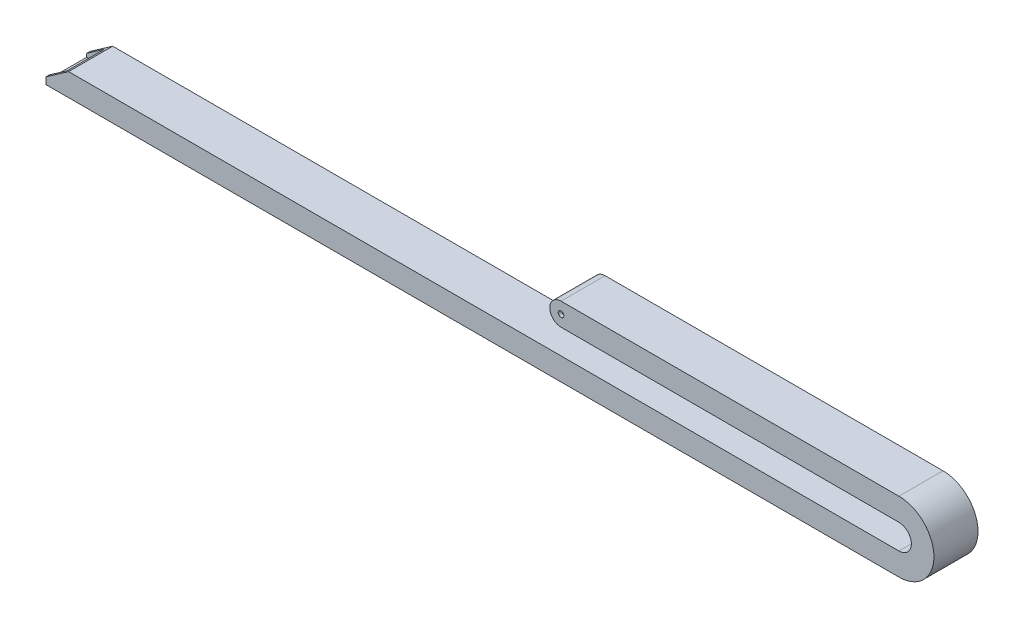
ISO-10303-21;
HEADER;
FILE_DESCRIPTION(('STEP AP214'),'2;1');
FILE_NAME('part.step','',(''),(''),'','','');
FILE_SCHEMA(('AUTOMOTIVE_DESIGN { 1 0 10303 214 1 1 1 1 }'));
ENDSEC;
DATA;
#1=APPLICATION_CONTEXT('core data for automotive mechanical design processes');
#2=APPLICATION_PROTOCOL_DEFINITION('international standard','automotive_design',2000,#1);
#3=PRODUCT_CONTEXT('',#1,'mechanical');
#4=PRODUCT('Part','Part','',(#3));
#5=PRODUCT_RELATED_PRODUCT_CATEGORY('part','',(#4));
#6=PRODUCT_DEFINITION_FORMATION('','',#4);
#7=PRODUCT_DEFINITION_CONTEXT('part definition',#1,'design');
#8=PRODUCT_DEFINITION('design','',#6,#7);
#9=PRODUCT_DEFINITION_SHAPE('','',#8);
#10=(LENGTH_UNIT() NAMED_UNIT(*) SI_UNIT(.MILLI.,.METRE.));
#11=(NAMED_UNIT(*) PLANE_ANGLE_UNIT() SI_UNIT($,.RADIAN.));
#12=(NAMED_UNIT(*) SI_UNIT($,.STERADIAN.) SOLID_ANGLE_UNIT());
#13=UNCERTAINTY_MEASURE_WITH_UNIT(LENGTH_MEASURE(1.E-05),#10,'distance_accuracy_value','');
#14=(GEOMETRIC_REPRESENTATION_CONTEXT(3) GLOBAL_UNCERTAINTY_ASSIGNED_CONTEXT((#13)) GLOBAL_UNIT_ASSIGNED_CONTEXT((#10,
#11,#12)) REPRESENTATION_CONTEXT('',''));
#15=CARTESIAN_POINT('',(0.,0.,0.));
#16=DIRECTION('',(0.,0.,1.));
#17=DIRECTION('',(1.,0.,0.));
#18=AXIS2_PLACEMENT_3D('',#15,#16,#17);
#19=CARTESIAN_POINT('',(-425.902299808804,39.9999999999996,39.));
#20=DIRECTION('',(0.57357643635105,-0.819152044288989,0.));
#21=DIRECTION('',(0.819152044288989,0.57357643635105,0.));
#22=AXIS2_PLACEMENT_3D('',#19,#20,#21);
#23=PLANE('',#22);
#24=DIRECTION('',(0.,0.,-1.));
#25=VECTOR('',#24,1.);
#26=CARTESIAN_POINT('',(-445.896371903194,25.9999999999996,39.));
#27=LINE('',#26,#25);
#28=CARTESIAN_POINT('',(-445.896371903194,25.9999999999996,3.));
#29=VERTEX_POINT('',#28);
#30=CARTESIAN_POINT('',(-445.896371903194,25.9999999999996,0.));
#31=VERTEX_POINT('',#30);
#32=EDGE_CURVE('E41',#29,#31,#27,.T.);
#33=ORIENTED_EDGE('',*,*,#32,.F.);
#34=DIRECTION('',(-0.819152044288989,-0.57357643635105,0.));
#35=VECTOR('',#34,1.);
#36=CARTESIAN_POINT('',(-425.902299808804,39.9999999999996,3.));
#37=LINE('',#36,#35);
#38=CARTESIAN_POINT('',(-430.18674382903,36.9999999999996,3.));
#39=VERTEX_POINT('',#38);
#40=EDGE_CURVE('E172',#39,#29,#37,.T.);
#41=ORIENTED_EDGE('',*,*,#40,.F.);
#42=DIRECTION('',(0.,0.,-1.));
#43=VECTOR('',#42,1.);
#44=CARTESIAN_POINT('',(-430.18674382903,36.9999999999996,39.));
#45=LINE('',#44,#43);
#46=CARTESIAN_POINT('',(-430.18674382903,36.9999999999996,36.));
#47=VERTEX_POINT('',#46);
#48=EDGE_CURVE('E228',#47,#39,#45,.T.);
#49=ORIENTED_EDGE('',*,*,#48,.F.);
#50=DIRECTION('',(-0.819152044288989,-0.57357643635105,0.));
#51=VECTOR('',#50,1.);
#52=CARTESIAN_POINT('',(-425.902299808804,39.9999999999996,36.));
#53=LINE('',#52,#51);
#54=CARTESIAN_POINT('',(-445.896371903194,25.9999999999996,36.));
#55=VERTEX_POINT('',#54);
#56=EDGE_CURVE('E207',#47,#55,#53,.T.);
#57=ORIENTED_EDGE('',*,*,#56,.T.);
#58=CARTESIAN_POINT('',(-445.896371903194,25.9999999999996,39.));
#59=VERTEX_POINT('',#58);
#60=EDGE_CURVE('E11',#59,#55,#27,.T.);
#61=ORIENTED_EDGE('',*,*,#60,.F.);
#62=DIRECTION('',(-0.819152044288989,-0.57357643635105,0.));
#63=VECTOR('',#62,1.);
#64=CARTESIAN_POINT('',(-425.902299808804,39.9999999999996,39.));
#65=LINE('',#64,#63);
#66=CARTESIAN_POINT('',(-425.902299808804,39.9999999999996,39.));
#67=VERTEX_POINT('',#66);
#68=EDGE_CURVE('E235',#67,#59,#65,.T.);
#69=ORIENTED_EDGE('',*,*,#68,.F.);
#70=DIRECTION('',(0.,0.,-1.));
#71=VECTOR('',#70,1.);
#72=CARTESIAN_POINT('',(-425.902299808804,39.9999999999996,39.));
#73=LINE('',#72,#71);
#74=CARTESIAN_POINT('',(-425.902299808804,39.9999999999996,0.));
#75=VERTEX_POINT('',#74);
#76=EDGE_CURVE('E255',#67,#75,#73,.T.);
#77=ORIENTED_EDGE('',*,*,#76,.T.);
#78=DIRECTION('',(-0.819152044288989,-0.57357643635105,0.));
#79=VECTOR('',#78,1.);
#80=CARTESIAN_POINT('',(-425.902299808804,39.9999999999996,0.));
#81=LINE('',#80,#79);
#82=EDGE_CURVE('E202',#75,#31,#81,.T.);
#83=ORIENTED_EDGE('',*,*,#82,.T.);
#84=EDGE_LOOP('',(#33,#41,#49,#57,#61,#69,#77,#83));
#85=FACE_BOUND('',#84,.T.);
#86=ADVANCED_FACE('F33',(#85),#23,.F.);
#87=CARTESIAN_POINT('',(-445.896371903194,25.9999999999996,39.));
#88=DIRECTION('',(1.,0.,0.));
#89=DIRECTION('',(0.,1.,0.));
#90=AXIS2_PLACEMENT_3D('',#87,#88,#89);
#91=PLANE('',#90);
#92=DIRECTION('',(0.,0.,1.));
#93=VECTOR('',#92,1.);
#94=CARTESIAN_POINT('',(-445.896371903194,22.9999999999996,3.));
#95=LINE('',#94,#93);
#96=CARTESIAN_POINT('',(-445.896371903194,22.9999999999996,3.));
#97=VERTEX_POINT('',#96);
#98=CARTESIAN_POINT('',(-445.896371903194,22.9999999999996,36.));
#99=VERTEX_POINT('',#98);
#100=EDGE_CURVE('E165',#97,#99,#95,.T.);
#101=ORIENTED_EDGE('',*,*,#100,.F.);
#102=DIRECTION('',(0.,-1.,0.));
#103=VECTOR('',#102,1.);
#104=CARTESIAN_POINT('',(-445.896371903194,36.9999999999996,3.));
#105=LINE('',#104,#103);
#106=EDGE_CURVE('E175',#29,#97,#105,.T.);
#107=ORIENTED_EDGE('',*,*,#106,.F.);
#108=ORIENTED_EDGE('',*,*,#32,.T.);
#109=DIRECTION('',(0.,-1.,0.));
#110=VECTOR('',#109,1.);
#111=CARTESIAN_POINT('',(-445.896371903194,25.9999999999996,0.));
#112=LINE('',#111,#110);
#113=CARTESIAN_POINT('',(-445.896371903194,19.9999999999996,0.));
#114=VERTEX_POINT('',#113);
#115=EDGE_CURVE('E258',#31,#114,#112,.T.);
#116=ORIENTED_EDGE('',*,*,#115,.T.);
#117=DIRECTION('',(0.,0.,-1.));
#118=VECTOR('',#117,1.);
#119=CARTESIAN_POINT('',(-445.896371903194,19.9999999999996,39.));
#120=LINE('',#119,#118);
#121=CARTESIAN_POINT('',(-445.896371903194,19.9999999999996,39.));
#122=VERTEX_POINT('',#121);
#123=EDGE_CURVE('E293',#122,#114,#120,.T.);
#124=ORIENTED_EDGE('',*,*,#123,.F.);
#125=DIRECTION('',(0.,-1.,0.));
#126=VECTOR('',#125,1.);
#127=CARTESIAN_POINT('',(-445.896371903194,25.9999999999996,39.));
#128=LINE('',#127,#126);
#129=EDGE_CURVE('E238',#59,#122,#128,.T.);
#130=ORIENTED_EDGE('',*,*,#129,.F.);
#131=ORIENTED_EDGE('',*,*,#60,.T.);
#132=DIRECTION('',(0.,1.,0.));
#133=VECTOR('',#132,1.);
#134=CARTESIAN_POINT('',(-445.896371903194,36.9999999999996,36.));
#135=LINE('',#134,#133);
#136=EDGE_CURVE('E184',#99,#55,#135,.T.);
#137=ORIENTED_EDGE('',*,*,#136,.F.);
#138=EDGE_LOOP('',(#101,#107,#108,#116,#124,#130,#131,#137));
#139=FACE_BOUND('',#138,.T.);
#140=ADVANCED_FACE('F182',(#139),#91,.F.);
#141=CARTESIAN_POINT('',(-445.896371903194,19.9999999999996,39.));
#142=DIRECTION('',(0.,1.,0.));
#143=DIRECTION('',(-1.,0.,0.));
#144=AXIS2_PLACEMENT_3D('',#141,#142,#143);
#145=PLANE('',#144);
#146=DIRECTION('',(1.,0.,0.));
#147=VECTOR('',#146,1.);
#148=CARTESIAN_POINT('',(-445.896371903194,19.9999999999996,0.));
#149=LINE('',#148,#147);
#150=CARTESIAN_POINT('',(309.062127232909,20.0000000000002,0.));
#151=VERTEX_POINT('',#150);
#152=EDGE_CURVE('E260',#114,#151,#149,.T.);
#153=ORIENTED_EDGE('',*,*,#152,.T.);
#154=DIRECTION('',(0.,0.,-1.));
#155=VECTOR('',#154,1.);
#156=CARTESIAN_POINT('',(309.062127232909,20.0000000000002,39.));
#157=LINE('',#156,#155);
#158=CARTESIAN_POINT('',(309.062127232909,20.0000000000002,39.));
#159=VERTEX_POINT('',#158);
#160=EDGE_CURVE('E290',#159,#151,#157,.T.);
#161=ORIENTED_EDGE('',*,*,#160,.F.);
#162=DIRECTION('',(1.,0.,0.));
#163=VECTOR('',#162,1.);
#164=CARTESIAN_POINT('',(-445.896371903194,19.9999999999996,39.));
#165=LINE('',#164,#163);
#166=EDGE_CURVE('E241',#122,#159,#165,.T.);
#167=ORIENTED_EDGE('',*,*,#166,.F.);
#168=ORIENTED_EDGE('',*,*,#123,.T.);
#169=EDGE_LOOP('',(#153,#161,#167,#168));
#170=FACE_BOUND('',#169,.T.);
#171=ADVANCED_FACE('F337',(#170),#145,.F.);
#172=CARTESIAN_POINT('',(309.062127232909,51.0000000000001,39.));
#173=DIRECTION('',(0.,0.,-1.));
#174=DIRECTION('',(-1.,0.,0.));
#175=AXIS2_PLACEMENT_3D('',#172,#173,#174);
#176=CYLINDRICAL_SURFACE('',#175,30.9999999999999);
#177=CARTESIAN_POINT('',(309.062127232909,51.0000000000001,0.));
#178=DIRECTION('',(0.,0.,1.));
#179=DIRECTION('',(1.,0.,0.));
#180=AXIS2_PLACEMENT_3D('',#177,#178,#179);
#181=CIRCLE('',#180,30.9999999999999);
#182=CARTESIAN_POINT('',(309.062127232909,82.0000000000001,0.));
#183=VERTEX_POINT('',#182);
#184=EDGE_CURVE('E262',#151,#183,#181,.T.);
#185=ORIENTED_EDGE('',*,*,#184,.T.);
#186=DIRECTION('',(0.,0.,-1.));
#187=VECTOR('',#186,1.);
#188=CARTESIAN_POINT('',(309.062127232909,82.0000000000001,39.));
#189=LINE('',#188,#187);
#190=CARTESIAN_POINT('',(309.062127232909,82.0000000000001,39.));
#191=VERTEX_POINT('',#190);
#192=EDGE_CURVE('E287',#191,#183,#189,.T.);
#193=ORIENTED_EDGE('',*,*,#192,.F.);
#194=CARTESIAN_POINT('',(309.062127232909,51.0000000000001,39.));
#195=DIRECTION('',(0.,0.,1.));
#196=DIRECTION('',(1.,0.,0.));
#197=AXIS2_PLACEMENT_3D('',#194,#195,#196);
#198=CIRCLE('',#197,30.9999999999999);
#199=EDGE_CURVE('E243',#159,#191,#198,.T.);
#200=ORIENTED_EDGE('',*,*,#199,.F.);
#201=ORIENTED_EDGE('',*,*,#160,.T.);
#202=EDGE_LOOP('',(#185,#193,#200,#201));
#203=FACE_BOUND('',#202,.T.);
#204=ADVANCED_FACE('F335',(#203),#176,.T.);
#205=CARTESIAN_POINT('',(309.062127232909,82.0000000000001,39.));
#206=DIRECTION('',(0.,-1.,0.));
#207=DIRECTION('',(1.,0.,0.));
#208=AXIS2_PLACEMENT_3D('',#205,#206,#207);
#209=PLANE('',#208);
#210=DIRECTION('',(-1.,0.,0.));
#211=VECTOR('',#210,1.);
#212=CARTESIAN_POINT('',(309.062127232909,82.0000000000001,0.));
#213=LINE('',#212,#211);
#214=CARTESIAN_POINT('',(10.0000000000079,82.0000000000001,0.));
#215=VERTEX_POINT('',#214);
#216=EDGE_CURVE('E264',#183,#215,#213,.T.);
#217=ORIENTED_EDGE('',*,*,#216,.T.);
#218=DIRECTION('',(0.,0.,-1.));
#219=VECTOR('',#218,1.);
#220=CARTESIAN_POINT('',(10.0000000000079,82.0000000000001,39.));
#221=LINE('',#220,#219);
#222=CARTESIAN_POINT('',(10.0000000000079,82.0000000000001,39.));
#223=VERTEX_POINT('',#222);
#224=EDGE_CURVE('E284',#223,#215,#221,.T.);
#225=ORIENTED_EDGE('',*,*,#224,.F.);
#226=DIRECTION('',(-1.,0.,0.));
#227=VECTOR('',#226,1.);
#228=CARTESIAN_POINT('',(309.062127232909,82.0000000000001,39.));
#229=LINE('',#228,#227);
#230=EDGE_CURVE('E245',#191,#223,#229,.T.);
#231=ORIENTED_EDGE('',*,*,#230,.F.);
#232=ORIENTED_EDGE('',*,*,#192,.T.);
#233=EDGE_LOOP('',(#217,#225,#231,#232));
#234=FACE_BOUND('',#233,.T.);
#235=ADVANCED_FACE('F330',(#234),#209,.F.);
#236=CARTESIAN_POINT('',(10.0000000000079,72.0000000000001,39.));
#237=DIRECTION('',(0.,0.,-1.));
#238=DIRECTION('',(-1.,0.,0.));
#239=AXIS2_PLACEMENT_3D('',#236,#237,#238);
#240=CYLINDRICAL_SURFACE('',#239,10.);
#241=DIRECTION('',(0.,0.,-1.));
#242=VECTOR('',#241,1.);
#243=CARTESIAN_POINT('',(2.85857157146506,65.0000000000001,39.));
#244=LINE('',#243,#242);
#245=CARTESIAN_POINT('',(2.85857157146506,65.0000000000001,36.));
#246=VERTEX_POINT('',#245);
#247=CARTESIAN_POINT('',(2.85857157146506,65.0000000000001,3.));
#248=VERTEX_POINT('',#247);
#249=EDGE_CURVE('E186',#246,#248,#244,.T.);
#250=ORIENTED_EDGE('',*,*,#249,.T.);
#251=CARTESIAN_POINT('',(10.0000000000079,72.0000000000001,3.));
#252=DIRECTION('',(0.,0.,-1.));
#253=DIRECTION('',(0.,1.,0.));
#254=AXIS2_PLACEMENT_3D('',#251,#252,#253);
#255=CIRCLE('',#254,10.);
#256=CARTESIAN_POINT('',(2.85857157146506,79.0000000000001,3.));
#257=VERTEX_POINT('',#256);
#258=EDGE_CURVE('E198',#248,#257,#255,.T.);
#259=ORIENTED_EDGE('',*,*,#258,.T.);
#260=DIRECTION('',(0.,0.,-1.));
#261=VECTOR('',#260,1.);
#262=CARTESIAN_POINT('',(2.85857157146506,79.0000000000001,39.));
#263=LINE('',#262,#261);
#264=CARTESIAN_POINT('',(2.85857157146506,79.0000000000001,36.));
#265=VERTEX_POINT('',#264);
#266=EDGE_CURVE('E192',#257,#265,#263,.F.);
#267=ORIENTED_EDGE('',*,*,#266,.T.);
#268=CARTESIAN_POINT('',(10.0000000000079,72.0000000000001,36.));
#269=DIRECTION('',(0.,0.,1.));
#270=DIRECTION('',(1.,0.,0.));
#271=AXIS2_PLACEMENT_3D('',#268,#269,#270);
#272=CIRCLE('',#271,10.);
#273=EDGE_CURVE('E195',#265,#246,#272,.T.);
#274=ORIENTED_EDGE('',*,*,#273,.T.);
#275=EDGE_LOOP('',(#250,#259,#267,#274));
#276=FACE_BOUND('',#275,.T.);
#277=CARTESIAN_POINT('',(10.0000000000079,72.0000000000001,0.));
#278=DIRECTION('',(0.,0.,1.));
#279=DIRECTION('',(1.,0.,0.));
#280=AXIS2_PLACEMENT_3D('',#277,#278,#279);
#281=CIRCLE('',#280,10.);
#282=CARTESIAN_POINT('',(10.0000000000079,62.0000000000001,0.));
#283=VERTEX_POINT('',#282);
#284=EDGE_CURVE('E266',#215,#283,#281,.T.);
#285=ORIENTED_EDGE('',*,*,#284,.T.);
#286=DIRECTION('',(0.,0.,-1.));
#287=VECTOR('',#286,1.);
#288=CARTESIAN_POINT('',(10.0000000000079,62.0000000000001,39.));
#289=LINE('',#288,#287);
#290=CARTESIAN_POINT('',(10.0000000000079,62.0000000000001,39.));
#291=VERTEX_POINT('',#290);
#292=EDGE_CURVE('E281',#291,#283,#289,.T.);
#293=ORIENTED_EDGE('',*,*,#292,.F.);
#294=CARTESIAN_POINT('',(10.0000000000079,72.0000000000001,39.));
#295=DIRECTION('',(0.,0.,1.));
#296=DIRECTION('',(1.,0.,0.));
#297=AXIS2_PLACEMENT_3D('',#294,#295,#296);
#298=CIRCLE('',#297,10.);
#299=EDGE_CURVE('E247',#223,#291,#298,.T.);
#300=ORIENTED_EDGE('',*,*,#299,.F.);
#301=ORIENTED_EDGE('',*,*,#224,.T.);
#302=EDGE_LOOP('',(#285,#293,#300,#301));
#303=FACE_BOUND('',#302,.T.);
#304=ADVANCED_FACE('F326',(#276,#303),#240,.T.);
#305=CARTESIAN_POINT('',(10.0000000000079,62.0000000000001,39.));
#306=DIRECTION('',(0.,1.,0.));
#307=DIRECTION('',(-1.,0.,0.));
#308=AXIS2_PLACEMENT_3D('',#305,#306,#307);
#309=PLANE('',#308);
#310=DIRECTION('',(1.,0.,0.));
#311=VECTOR('',#310,1.);
#312=CARTESIAN_POINT('',(10.0000000000079,62.0000000000001,0.));
#313=LINE('',#312,#311);
#314=CARTESIAN_POINT('',(309.062127232909,62.0000000000001,0.));
#315=VERTEX_POINT('',#314);
#316=EDGE_CURVE('E268',#283,#315,#313,.T.);
#317=ORIENTED_EDGE('',*,*,#316,.T.);
#318=DIRECTION('',(0.,0.,-1.));
#319=VECTOR('',#318,1.);
#320=CARTESIAN_POINT('',(309.062127232909,62.0000000000001,39.));
#321=LINE('',#320,#319);
#322=CARTESIAN_POINT('',(309.062127232909,62.0000000000001,39.));
#323=VERTEX_POINT('',#322);
#324=EDGE_CURVE('E278',#323,#315,#321,.T.);
#325=ORIENTED_EDGE('',*,*,#324,.F.);
#326=DIRECTION('',(1.,0.,0.));
#327=VECTOR('',#326,1.);
#328=CARTESIAN_POINT('',(10.0000000000079,62.0000000000001,39.));
#329=LINE('',#328,#327);
#330=EDGE_CURVE('E249',#291,#323,#329,.T.);
#331=ORIENTED_EDGE('',*,*,#330,.F.);
#332=ORIENTED_EDGE('',*,*,#292,.T.);
#333=EDGE_LOOP('',(#317,#325,#331,#332));
#334=FACE_BOUND('',#333,.T.);
#335=ADVANCED_FACE('F322',(#334),#309,.F.);
#336=CARTESIAN_POINT('',(309.062127232909,51.0000000000001,39.));
#337=DIRECTION('',(0.,0.,-1.));
#338=DIRECTION('',(-1.,0.,0.));
#339=AXIS2_PLACEMENT_3D('',#336,#337,#338);
#340=CYLINDRICAL_SURFACE('',#339,10.9999999999999);
#341=CARTESIAN_POINT('',(309.062127232909,51.0000000000001,0.));
#342=DIRECTION('',(0.,0.,-1.));
#343=DIRECTION('',(1.,0.,0.));
#344=AXIS2_PLACEMENT_3D('',#341,#342,#343);
#345=CIRCLE('',#344,10.9999999999999);
#346=CARTESIAN_POINT('',(309.062127232909,40.0000000000002,0.));
#347=VERTEX_POINT('',#346);
#348=EDGE_CURVE('E270',#315,#347,#345,.T.);
#349=ORIENTED_EDGE('',*,*,#348,.T.);
#350=DIRECTION('',(0.,0.,-1.));
#351=VECTOR('',#350,1.);
#352=CARTESIAN_POINT('',(309.062127232909,40.0000000000002,39.));
#353=LINE('',#352,#351);
#354=CARTESIAN_POINT('',(309.062127232909,40.0000000000002,39.));
#355=VERTEX_POINT('',#354);
#356=EDGE_CURVE('E275',#355,#347,#353,.T.);
#357=ORIENTED_EDGE('',*,*,#356,.F.);
#358=CARTESIAN_POINT('',(309.062127232909,51.0000000000001,39.));
#359=DIRECTION('',(0.,0.,-1.));
#360=DIRECTION('',(1.,0.,0.));
#361=AXIS2_PLACEMENT_3D('',#358,#359,#360);
#362=CIRCLE('',#361,10.9999999999999);
#363=EDGE_CURVE('E251',#323,#355,#362,.T.);
#364=ORIENTED_EDGE('',*,*,#363,.F.);
#365=ORIENTED_EDGE('',*,*,#324,.T.);
#366=EDGE_LOOP('',(#349,#357,#364,#365));
#367=FACE_BOUND('',#366,.T.);
#368=ADVANCED_FACE('F317',(#367),#340,.F.);
#369=CARTESIAN_POINT('',(309.062127232909,40.0000000000002,39.));
#370=DIRECTION('',(0.,-1.,0.));
#371=DIRECTION('',(1.,0.,0.));
#372=AXIS2_PLACEMENT_3D('',#369,#370,#371);
#373=PLANE('',#372);
#374=DIRECTION('',(-1.,0.,0.));
#375=VECTOR('',#374,1.);
#376=CARTESIAN_POINT('',(309.062127232909,40.0000000000002,0.));
#377=LINE('',#376,#375);
#378=EDGE_CURVE('E239',#347,#75,#377,.T.);
#379=ORIENTED_EDGE('',*,*,#378,.T.);
#380=ORIENTED_EDGE('',*,*,#76,.F.);
#381=DIRECTION('',(-1.,0.,0.));
#382=VECTOR('',#381,1.);
#383=CARTESIAN_POINT('',(309.062127232909,40.0000000000002,39.));
#384=LINE('',#383,#382);
#385=EDGE_CURVE('E253',#355,#67,#384,.T.);
#386=ORIENTED_EDGE('',*,*,#385,.F.);
#387=ORIENTED_EDGE('',*,*,#356,.T.);
#388=EDGE_LOOP('',(#379,#380,#386,#387));
#389=FACE_BOUND('',#388,.T.);
#390=ADVANCED_FACE('F311',(#389),#373,.F.);
#391=CARTESIAN_POINT('',(309.062127232909,51.0000000000001,39.));
#392=DIRECTION('',(0.,0.,1.));
#393=DIRECTION('',(1.,0.,0.));
#394=AXIS2_PLACEMENT_3D('',#391,#392,#393);
#395=PLANE('',#394);
#396=CARTESIAN_POINT('',(10.0000000000079,72.0000000000001,39.));
#397=DIRECTION('',(0.,0.,1.));
#398=DIRECTION('',(1.,0.,0.));
#399=AXIS2_PLACEMENT_3D('',#396,#397,#398);
#400=CIRCLE('',#399,2.5);
#401=CARTESIAN_POINT('',(12.5000000000079,72.0000000000001,39.));
#402=VERTEX_POINT('',#401);
#403=EDGE_CURVE('E412',#402,#402,#400,.T.);
#404=ORIENTED_EDGE('',*,*,#403,.F.);
#405=EDGE_LOOP('',(#404));
#406=FACE_BOUND('',#405,.T.);
#407=ORIENTED_EDGE('',*,*,#68,.T.);
#408=ORIENTED_EDGE('',*,*,#129,.T.);
#409=ORIENTED_EDGE('',*,*,#166,.T.);
#410=ORIENTED_EDGE('',*,*,#199,.T.);
#411=ORIENTED_EDGE('',*,*,#230,.T.);
#412=ORIENTED_EDGE('',*,*,#299,.T.);
#413=ORIENTED_EDGE('',*,*,#330,.T.);
#414=ORIENTED_EDGE('',*,*,#363,.T.);
#415=ORIENTED_EDGE('',*,*,#385,.T.);
#416=EDGE_LOOP('',(#407,#408,#409,#410,#411,#412,#413,#414,#415));
#417=FACE_BOUND('',#416,.T.);
#418=ADVANCED_FACE('F339',(#406,#417),#395,.T.);
#419=CARTESIAN_POINT('',(309.062127232909,51.0000000000001,0.));
#420=DIRECTION('',(0.,0.,1.));
#421=DIRECTION('',(1.,0.,0.));
#422=AXIS2_PLACEMENT_3D('',#419,#420,#421);
#423=PLANE('',#422);
#424=CARTESIAN_POINT('',(10.0000000000079,72.0000000000001,0.));
#425=DIRECTION('',(0.,0.,1.));
#426=DIRECTION('',(1.,0.,0.));
#427=AXIS2_PLACEMENT_3D('',#424,#425,#426);
#428=CIRCLE('',#427,2.5);
#429=CARTESIAN_POINT('',(12.5000000000079,72.0000000000001,0.));
#430=VERTEX_POINT('',#429);
#431=EDGE_CURVE('E409',#430,#430,#428,.T.);
#432=ORIENTED_EDGE('',*,*,#431,.T.);
#433=EDGE_LOOP('',(#432));
#434=FACE_BOUND('',#433,.T.);
#435=ORIENTED_EDGE('',*,*,#82,.F.);
#436=ORIENTED_EDGE('',*,*,#378,.F.);
#437=ORIENTED_EDGE('',*,*,#348,.F.);
#438=ORIENTED_EDGE('',*,*,#316,.F.);
#439=ORIENTED_EDGE('',*,*,#284,.F.);
#440=ORIENTED_EDGE('',*,*,#216,.F.);
#441=ORIENTED_EDGE('',*,*,#184,.F.);
#442=ORIENTED_EDGE('',*,*,#152,.F.);
#443=ORIENTED_EDGE('',*,*,#115,.F.);
#444=EDGE_LOOP('',(#435,#436,#437,#438,#439,#440,#441,#442,#443));
#445=FACE_BOUND('',#444,.T.);
#446=ADVANCED_FACE('F303',(#434,#445),#423,.F.);
#447=CARTESIAN_POINT('',(-445.896371903194,22.9999999999996,39.));
#448=DIRECTION('',(0.,1.,0.));
#449=DIRECTION('',(-1.,0.,0.));
#450=AXIS2_PLACEMENT_3D('',#447,#448,#449);
#451=PLANE('',#450);
#452=DIRECTION('',(1.,0.,0.));
#453=VECTOR('',#452,1.);
#454=CARTESIAN_POINT('',(-445.896371903194,22.9999999999996,36.));
#455=LINE('',#454,#453);
#456=CARTESIAN_POINT('',(309.062127232909,23.0000000000002,36.));
#457=VERTEX_POINT('',#456);
#458=EDGE_CURVE('E204',#99,#457,#455,.T.);
#459=ORIENTED_EDGE('',*,*,#458,.T.);
#460=DIRECTION('',(0.,0.,-1.));
#461=VECTOR('',#460,1.);
#462=CARTESIAN_POINT('',(309.062127232909,23.0000000000002,39.));
#463=LINE('',#462,#461);
#464=CARTESIAN_POINT('',(309.062127232909,23.0000000000002,3.));
#465=VERTEX_POINT('',#464);
#466=EDGE_CURVE('E168',#457,#465,#463,.T.);
#467=ORIENTED_EDGE('',*,*,#466,.T.);
#468=DIRECTION('',(1.,0.,0.));
#469=VECTOR('',#468,1.);
#470=CARTESIAN_POINT('',(-445.896371903194,22.9999999999996,3.));
#471=LINE('',#470,#469);
#472=EDGE_CURVE('E161',#97,#465,#471,.T.);
#473=ORIENTED_EDGE('',*,*,#472,.F.);
#474=ORIENTED_EDGE('',*,*,#100,.T.);
#475=EDGE_LOOP('',(#459,#467,#473,#474));
#476=FACE_BOUND('',#475,.T.);
#477=ADVANCED_FACE('F163',(#476),#451,.T.);
#478=CARTESIAN_POINT('',(309.062127232909,51.0000000000001,39.));
#479=DIRECTION('',(0.,0.,-1.));
#480=DIRECTION('',(-1.,0.,0.));
#481=AXIS2_PLACEMENT_3D('',#478,#479,#480);
#482=CYLINDRICAL_SURFACE('',#481,27.9999999999999);
#483=CARTESIAN_POINT('',(309.062127232909,51.0000000000001,3.));
#484=DIRECTION('',(0.,0.,1.));
#485=DIRECTION('',(1.,0.,0.));
#486=AXIS2_PLACEMENT_3D('',#483,#484,#485);
#487=CIRCLE('',#486,27.9999999999999);
#488=CARTESIAN_POINT('',(309.062127232909,79.0000000000001,3.));
#489=VERTEX_POINT('',#488);
#490=EDGE_CURVE('E171',#465,#489,#487,.T.);
#491=ORIENTED_EDGE('',*,*,#490,.F.);
#492=ORIENTED_EDGE('',*,*,#466,.F.);
#493=CARTESIAN_POINT('',(309.062127232909,51.0000000000001,36.));
#494=DIRECTION('',(0.,0.,1.));
#495=DIRECTION('',(1.,0.,0.));
#496=AXIS2_PLACEMENT_3D('',#493,#494,#495);
#497=CIRCLE('',#496,27.9999999999999);
#498=CARTESIAN_POINT('',(309.062127232909,79.0000000000001,36.));
#499=VERTEX_POINT('',#498);
#500=EDGE_CURVE('E206',#457,#499,#497,.T.);
#501=ORIENTED_EDGE('',*,*,#500,.T.);
#502=DIRECTION('',(0.,0.,1.));
#503=VECTOR('',#502,1.);
#504=CARTESIAN_POINT('',(309.062127232909,79.0000000000001,39.));
#505=LINE('',#504,#503);
#506=EDGE_CURVE('E203',#499,#489,#505,.F.);
#507=ORIENTED_EDGE('',*,*,#506,.T.);
#508=EDGE_LOOP('',(#491,#492,#501,#507));
#509=FACE_BOUND('',#508,.T.);
#510=ADVANCED_FACE('F346',(#509),#482,.F.);
#511=CARTESIAN_POINT('',(309.062127232909,79.0000000000001,39.));
#512=DIRECTION('',(0.,-1.,0.));
#513=DIRECTION('',(1.,0.,0.));
#514=AXIS2_PLACEMENT_3D('',#511,#512,#513);
#515=PLANE('',#514);
#516=DIRECTION('',(-1.,0.,0.));
#517=VECTOR('',#516,1.);
#518=CARTESIAN_POINT('',(309.062127232909,79.0000000000001,3.));
#519=LINE('',#518,#517);
#520=EDGE_CURVE('E209',#489,#257,#519,.T.);
#521=ORIENTED_EDGE('',*,*,#520,.F.);
#522=ORIENTED_EDGE('',*,*,#506,.F.);
#523=DIRECTION('',(-1.,0.,0.));
#524=VECTOR('',#523,1.);
#525=CARTESIAN_POINT('',(309.062127232909,79.0000000000001,36.));
#526=LINE('',#525,#524);
#527=EDGE_CURVE('E214',#499,#265,#526,.T.);
#528=ORIENTED_EDGE('',*,*,#527,.T.);
#529=ORIENTED_EDGE('',*,*,#266,.F.);
#530=EDGE_LOOP('',(#521,#522,#528,#529));
#531=FACE_BOUND('',#530,.T.);
#532=ADVANCED_FACE('F351',(#531),#515,.T.);
#533=CARTESIAN_POINT('',(10.0000000000079,65.0000000000001,39.));
#534=DIRECTION('',(0.,1.,0.));
#535=DIRECTION('',(-1.,0.,0.));
#536=AXIS2_PLACEMENT_3D('',#533,#534,#535);
#537=PLANE('',#536);
#538=DIRECTION('',(1.,0.,0.));
#539=VECTOR('',#538,1.);
#540=CARTESIAN_POINT('',(10.0000000000079,65.0000000000001,3.));
#541=LINE('',#540,#539);
#542=CARTESIAN_POINT('',(309.062127232909,65.0000000000001,3.));
#543=VERTEX_POINT('',#542);
#544=EDGE_CURVE('E48',#248,#543,#541,.T.);
#545=ORIENTED_EDGE('',*,*,#544,.F.);
#546=ORIENTED_EDGE('',*,*,#249,.F.);
#547=DIRECTION('',(1.,0.,0.));
#548=VECTOR('',#547,1.);
#549=CARTESIAN_POINT('',(10.0000000000079,65.0000000000001,36.));
#550=LINE('',#549,#548);
#551=CARTESIAN_POINT('',(309.062127232909,65.0000000000001,36.));
#552=VERTEX_POINT('',#551);
#553=EDGE_CURVE('E217',#246,#552,#550,.T.);
#554=ORIENTED_EDGE('',*,*,#553,.T.);
#555=DIRECTION('',(0.,0.,-1.));
#556=VECTOR('',#555,1.);
#557=CARTESIAN_POINT('',(309.062127232909,65.0000000000001,39.));
#558=LINE('',#557,#556);
#559=EDGE_CURVE('E212',#552,#543,#558,.T.);
#560=ORIENTED_EDGE('',*,*,#559,.T.);
#561=EDGE_LOOP('',(#545,#546,#554,#560));
#562=FACE_BOUND('',#561,.T.);
#563=ADVANCED_FACE('F354',(#562),#537,.T.);
#564=CARTESIAN_POINT('',(309.062127232909,51.0000000000001,39.));
#565=DIRECTION('',(0.,0.,-1.));
#566=DIRECTION('',(-1.,0.,0.));
#567=AXIS2_PLACEMENT_3D('',#564,#565,#566);
#568=CYLINDRICAL_SURFACE('',#567,13.9999999999999);
#569=CARTESIAN_POINT('',(309.062127232909,51.0000000000001,3.));
#570=DIRECTION('',(0.,0.,1.));
#571=DIRECTION('',(1.,0.,0.));
#572=AXIS2_PLACEMENT_3D('',#569,#570,#571);
#573=CIRCLE('',#572,13.9999999999999);
#574=CARTESIAN_POINT('',(309.062127232909,37.0000000000002,3.));
#575=VERTEX_POINT('',#574);
#576=EDGE_CURVE('E219',#543,#575,#573,.F.);
#577=ORIENTED_EDGE('',*,*,#576,.F.);
#578=ORIENTED_EDGE('',*,*,#559,.F.);
#579=CARTESIAN_POINT('',(309.062127232909,51.0000000000001,36.));
#580=DIRECTION('',(0.,0.,1.));
#581=DIRECTION('',(1.,0.,0.));
#582=AXIS2_PLACEMENT_3D('',#579,#580,#581);
#583=CIRCLE('',#582,13.9999999999999);
#584=CARTESIAN_POINT('',(309.062127232909,37.0000000000002,36.));
#585=VERTEX_POINT('',#584);
#586=EDGE_CURVE('E223',#552,#585,#583,.F.);
#587=ORIENTED_EDGE('',*,*,#586,.T.);
#588=DIRECTION('',(0.,0.,1.));
#589=VECTOR('',#588,1.);
#590=CARTESIAN_POINT('',(309.062127232909,37.0000000000002,39.));
#591=LINE('',#590,#589);
#592=EDGE_CURVE('E221',#585,#575,#591,.F.);
#593=ORIENTED_EDGE('',*,*,#592,.T.);
#594=EDGE_LOOP('',(#577,#578,#587,#593));
#595=FACE_BOUND('',#594,.T.);
#596=ADVANCED_FACE('F359',(#595),#568,.T.);
#597=CARTESIAN_POINT('',(309.062127232909,37.0000000000002,39.));
#598=DIRECTION('',(0.,-1.,0.));
#599=DIRECTION('',(1.,0.,0.));
#600=AXIS2_PLACEMENT_3D('',#597,#598,#599);
#601=PLANE('',#600);
#602=ORIENTED_EDGE('',*,*,#48,.T.);
#603=DIRECTION('',(-1.,0.,0.));
#604=VECTOR('',#603,1.);
#605=CARTESIAN_POINT('',(309.062127232909,37.0000000000002,3.));
#606=LINE('',#605,#604);
#607=EDGE_CURVE('E225',#575,#39,#606,.T.);
#608=ORIENTED_EDGE('',*,*,#607,.F.);
#609=ORIENTED_EDGE('',*,*,#592,.F.);
#610=DIRECTION('',(-1.,0.,0.));
#611=VECTOR('',#610,1.);
#612=CARTESIAN_POINT('',(309.062127232909,37.0000000000002,36.));
#613=LINE('',#612,#611);
#614=EDGE_CURVE('E56',#585,#47,#613,.T.);
#615=ORIENTED_EDGE('',*,*,#614,.T.);
#616=EDGE_LOOP('',(#602,#608,#609,#615));
#617=FACE_BOUND('',#616,.T.);
#618=ADVANCED_FACE('F361',(#617),#601,.T.);
#619=CARTESIAN_POINT('',(309.062127232909,51.0000000000001,36.));
#620=DIRECTION('',(0.,0.,1.));
#621=DIRECTION('',(1.,0.,0.));
#622=AXIS2_PLACEMENT_3D('',#619,#620,#621);
#623=PLANE('',#622);
#624=CARTESIAN_POINT('',(10.0000000000079,72.0000000000001,36.));
#625=DIRECTION('',(0.,0.,1.));
#626=DIRECTION('',(1.,0.,0.));
#627=AXIS2_PLACEMENT_3D('',#624,#625,#626);
#628=CIRCLE('',#627,2.5);
#629=CARTESIAN_POINT('',(12.5000000000079,72.0000000000001,36.));
#630=VERTEX_POINT('',#629);
#631=EDGE_CURVE('E180',#630,#630,#628,.T.);
#632=ORIENTED_EDGE('',*,*,#631,.T.);
#633=EDGE_LOOP('',(#632));
#634=FACE_BOUND('',#633,.T.);
#635=ORIENTED_EDGE('',*,*,#56,.F.);
#636=ORIENTED_EDGE('',*,*,#614,.F.);
#637=ORIENTED_EDGE('',*,*,#586,.F.);
#638=ORIENTED_EDGE('',*,*,#553,.F.);
#639=ORIENTED_EDGE('',*,*,#273,.F.);
#640=ORIENTED_EDGE('',*,*,#527,.F.);
#641=ORIENTED_EDGE('',*,*,#500,.F.);
#642=ORIENTED_EDGE('',*,*,#458,.F.);
#643=ORIENTED_EDGE('',*,*,#136,.T.);
#644=EDGE_LOOP('',(#635,#636,#637,#638,#639,#640,#641,#642,#643));
#645=FACE_BOUND('',#644,.T.);
#646=ADVANCED_FACE('F342',(#634,#645),#623,.F.);
#647=CARTESIAN_POINT('',(309.062127232909,51.0000000000001,3.));
#648=DIRECTION('',(0.,0.,1.));
#649=DIRECTION('',(1.,0.,0.));
#650=AXIS2_PLACEMENT_3D('',#647,#648,#649);
#651=PLANE('',#650);
#652=CARTESIAN_POINT('',(10.0000000000079,72.0000000000001,3.));
#653=DIRECTION('',(0.,0.,1.));
#654=DIRECTION('',(1.,0.,0.));
#655=AXIS2_PLACEMENT_3D('',#652,#653,#654);
#656=CIRCLE('',#655,2.5);
#657=CARTESIAN_POINT('',(12.5000000000079,72.0000000000001,3.));
#658=VERTEX_POINT('',#657);
#659=EDGE_CURVE('E36',#658,#658,#656,.T.);
#660=ORIENTED_EDGE('',*,*,#659,.F.);
#661=EDGE_LOOP('',(#660));
#662=FACE_BOUND('',#661,.T.);
#663=ORIENTED_EDGE('',*,*,#472,.T.);
#664=ORIENTED_EDGE('',*,*,#490,.T.);
#665=ORIENTED_EDGE('',*,*,#520,.T.);
#666=ORIENTED_EDGE('',*,*,#258,.F.);
#667=ORIENTED_EDGE('',*,*,#544,.T.);
#668=ORIENTED_EDGE('',*,*,#576,.T.);
#669=ORIENTED_EDGE('',*,*,#607,.T.);
#670=ORIENTED_EDGE('',*,*,#40,.T.);
#671=ORIENTED_EDGE('',*,*,#106,.T.);
#672=EDGE_LOOP('',(#663,#664,#665,#666,#667,#668,#669,#670,#671));
#673=FACE_BOUND('',#672,.T.);
#674=ADVANCED_FACE('F176',(#662,#673),#651,.T.);
#675=CARTESIAN_POINT('',(10.0000000000079,72.0000000000001,0.));
#676=DIRECTION('',(0.,0.,1.));
#677=DIRECTION('',(1.,0.,0.));
#678=AXIS2_PLACEMENT_3D('',#675,#676,#677);
#679=CYLINDRICAL_SURFACE('',#678,2.5);
#680=ORIENTED_EDGE('',*,*,#659,.T.);
#681=EDGE_LOOP('',(#680));
#682=FACE_BOUND('',#681,.T.);
#683=ORIENTED_EDGE('',*,*,#431,.F.);
#684=EDGE_LOOP('',(#683));
#685=FACE_BOUND('',#684,.T.);
#686=ADVANCED_FACE('F399',(#682,#685),#679,.F.);
#687=ORIENTED_EDGE('',*,*,#403,.T.);
#688=EDGE_LOOP('',(#687));
#689=FACE_BOUND('',#688,.T.);
#690=ORIENTED_EDGE('',*,*,#631,.F.);
#691=EDGE_LOOP('',(#690));
#692=FACE_BOUND('',#691,.T.);
#693=ADVANCED_FACE('F404',(#689,#692),#679,.F.);
#694=CLOSED_SHELL('',(#86,#140,#171,#204,#235,#304,#335,#368,#390,#418,#446,#477,#510,#532,#563,
#596,#618,#646,#674,#686,#693));
#695=MANIFOLD_SOLID_BREP('B2',#694);
#696=ADVANCED_BREP_SHAPE_REPRESENTATION('',(#18,#695),#14);
#697=SHAPE_DEFINITION_REPRESENTATION(#9,#696);
ENDSEC;
END-ISO-10303-21;
